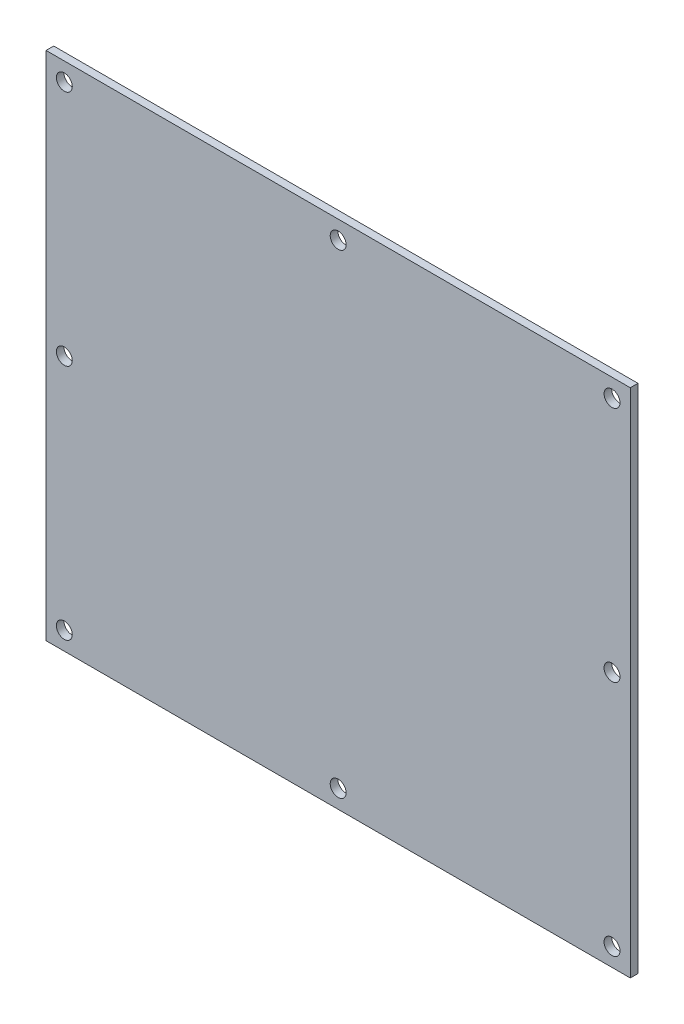
ISO-10303-21;
HEADER;
FILE_DESCRIPTION(('STEP AP214'),'2;1');
FILE_NAME('part.step','',(''),(''),'','','');
FILE_SCHEMA(('AUTOMOTIVE_DESIGN { 1 0 10303 214 1 1 1 1 }'));
ENDSEC;
DATA;
#1=APPLICATION_CONTEXT('core data for automotive mechanical design processes');
#2=APPLICATION_PROTOCOL_DEFINITION('international standard','automotive_design',2000,#1);
#3=PRODUCT_CONTEXT('',#1,'mechanical');
#4=PRODUCT('Part','Part','',(#3));
#5=PRODUCT_RELATED_PRODUCT_CATEGORY('part','',(#4));
#6=PRODUCT_DEFINITION_FORMATION('','',#4);
#7=PRODUCT_DEFINITION_CONTEXT('part definition',#1,'design');
#8=PRODUCT_DEFINITION('design','',#6,#7);
#9=PRODUCT_DEFINITION_SHAPE('','',#8);
#10=(LENGTH_UNIT() NAMED_UNIT(*) SI_UNIT(.MILLI.,.METRE.));
#11=(NAMED_UNIT(*) PLANE_ANGLE_UNIT() SI_UNIT($,.RADIAN.));
#12=(NAMED_UNIT(*) SI_UNIT($,.STERADIAN.) SOLID_ANGLE_UNIT());
#13=UNCERTAINTY_MEASURE_WITH_UNIT(LENGTH_MEASURE(1.E-05),#10,'distance_accuracy_value','');
#14=(GEOMETRIC_REPRESENTATION_CONTEXT(3) GLOBAL_UNCERTAINTY_ASSIGNED_CONTEXT((#13)) GLOBAL_UNIT_ASSIGNED_CONTEXT((#10,
#11,#12)) REPRESENTATION_CONTEXT('',''));
#15=CARTESIAN_POINT('',(0.,0.,0.));
#16=DIRECTION('',(0.,0.,1.));
#17=DIRECTION('',(1.,0.,0.));
#18=AXIS2_PLACEMENT_3D('',#15,#16,#17);
#19=CARTESIAN_POINT('',(0.,0.,2.667));
#20=DIRECTION('',(1.,0.,0.));
#21=DIRECTION('',(0.,0.,-1.));
#22=AXIS2_PLACEMENT_3D('',#19,#20,#21);
#23=PLANE('',#22);
#24=DIRECTION('',(0.,-1.,0.));
#25=VECTOR('',#24,1.);
#26=CARTESIAN_POINT('',(0.,0.,0.));
#27=LINE('',#26,#25);
#28=CARTESIAN_POINT('',(0.,177.8,0.));
#29=VERTEX_POINT('',#28);
#30=CARTESIAN_POINT('',(0.,0.,0.));
#31=VERTEX_POINT('',#30);
#32=EDGE_CURVE('E102',#29,#31,#27,.T.);
#33=ORIENTED_EDGE('',*,*,#32,.T.);
#34=DIRECTION('',(0.,0.,-1.));
#35=VECTOR('',#34,1.);
#36=CARTESIAN_POINT('',(0.,0.,2.667));
#37=LINE('',#36,#35);
#38=CARTESIAN_POINT('',(0.,0.,2.667));
#39=VERTEX_POINT('',#38);
#40=EDGE_CURVE('E11',#39,#31,#37,.T.);
#41=ORIENTED_EDGE('',*,*,#40,.F.);
#42=DIRECTION('',(0.,-1.,0.));
#43=VECTOR('',#42,1.);
#44=CARTESIAN_POINT('',(0.,0.,2.667));
#45=LINE('',#44,#43);
#46=CARTESIAN_POINT('',(0.,177.8,2.667));
#47=VERTEX_POINT('',#46);
#48=EDGE_CURVE('E90',#47,#39,#45,.T.);
#49=ORIENTED_EDGE('',*,*,#48,.F.);
#50=DIRECTION('',(0.,0.,-1.));
#51=VECTOR('',#50,1.);
#52=CARTESIAN_POINT('',(0.,177.8,2.667));
#53=LINE('',#52,#51);
#54=EDGE_CURVE('E98',#47,#29,#53,.T.);
#55=ORIENTED_EDGE('',*,*,#54,.T.);
#56=EDGE_LOOP('',(#33,#41,#49,#55));
#57=FACE_BOUND('',#56,.T.);
#58=ADVANCED_FACE('F39',(#57),#23,.F.);
#59=CARTESIAN_POINT('',(0.,0.,2.667));
#60=DIRECTION('',(0.,1.,0.));
#61=DIRECTION('',(0.,0.,1.));
#62=AXIS2_PLACEMENT_3D('',#59,#60,#61);
#63=PLANE('',#62);
#64=DIRECTION('',(1.,0.,0.));
#65=VECTOR('',#64,1.);
#66=CARTESIAN_POINT('',(0.,0.,0.));
#67=LINE('',#66,#65);
#68=CARTESIAN_POINT('',(203.2,0.,0.));
#69=VERTEX_POINT('',#68);
#70=EDGE_CURVE('E94',#31,#69,#67,.T.);
#71=ORIENTED_EDGE('',*,*,#70,.T.);
#72=DIRECTION('',(0.,0.,-1.));
#73=VECTOR('',#72,1.);
#74=CARTESIAN_POINT('',(203.2,0.,2.667));
#75=LINE('',#74,#73);
#76=CARTESIAN_POINT('',(203.2,0.,2.667));
#77=VERTEX_POINT('',#76);
#78=EDGE_CURVE('E47',#77,#69,#75,.T.);
#79=ORIENTED_EDGE('',*,*,#78,.F.);
#80=DIRECTION('',(1.,0.,0.));
#81=VECTOR('',#80,1.);
#82=CARTESIAN_POINT('',(0.,0.,2.667));
#83=LINE('',#82,#81);
#84=EDGE_CURVE('E85',#39,#77,#83,.T.);
#85=ORIENTED_EDGE('',*,*,#84,.F.);
#86=ORIENTED_EDGE('',*,*,#40,.T.);
#87=EDGE_LOOP('',(#71,#79,#85,#86));
#88=FACE_BOUND('',#87,.T.);
#89=ADVANCED_FACE('F93',(#88),#63,.F.);
#90=CARTESIAN_POINT('',(203.2,0.,2.667));
#91=DIRECTION('',(-1.,0.,0.));
#92=DIRECTION('',(0.,0.,1.));
#93=AXIS2_PLACEMENT_3D('',#90,#91,#92);
#94=PLANE('',#93);
#95=DIRECTION('',(0.,1.,0.));
#96=VECTOR('',#95,1.);
#97=CARTESIAN_POINT('',(203.2,0.,0.));
#98=LINE('',#97,#96);
#99=CARTESIAN_POINT('',(203.2,177.8,0.));
#100=VERTEX_POINT('',#99);
#101=EDGE_CURVE('E72',#69,#100,#98,.T.);
#102=ORIENTED_EDGE('',*,*,#101,.T.);
#103=DIRECTION('',(0.,0.,-1.));
#104=VECTOR('',#103,1.);
#105=CARTESIAN_POINT('',(203.2,177.8,2.667));
#106=LINE('',#105,#104);
#107=CARTESIAN_POINT('',(203.2,177.8,2.667));
#108=VERTEX_POINT('',#107);
#109=EDGE_CURVE('E95',#108,#100,#106,.T.);
#110=ORIENTED_EDGE('',*,*,#109,.F.);
#111=DIRECTION('',(0.,1.,0.));
#112=VECTOR('',#111,1.);
#113=CARTESIAN_POINT('',(203.2,0.,2.667));
#114=LINE('',#113,#112);
#115=EDGE_CURVE('E88',#77,#108,#114,.T.);
#116=ORIENTED_EDGE('',*,*,#115,.F.);
#117=ORIENTED_EDGE('',*,*,#78,.T.);
#118=EDGE_LOOP('',(#102,#110,#116,#117));
#119=FACE_BOUND('',#118,.T.);
#120=ADVANCED_FACE('F96',(#119),#94,.F.);
#121=CARTESIAN_POINT('',(0.,177.8,2.667));
#122=DIRECTION('',(0.,-1.,0.));
#123=DIRECTION('',(0.,0.,-1.));
#124=AXIS2_PLACEMENT_3D('',#121,#122,#123);
#125=PLANE('',#124);
#126=DIRECTION('',(-1.,0.,0.));
#127=VECTOR('',#126,1.);
#128=CARTESIAN_POINT('',(0.,177.8,0.));
#129=LINE('',#128,#127);
#130=EDGE_CURVE('E78',#100,#29,#129,.T.);
#131=ORIENTED_EDGE('',*,*,#130,.T.);
#132=ORIENTED_EDGE('',*,*,#54,.F.);
#133=DIRECTION('',(-1.,0.,0.));
#134=VECTOR('',#133,1.);
#135=CARTESIAN_POINT('',(0.,177.8,2.667));
#136=LINE('',#135,#134);
#137=EDGE_CURVE('E55',#108,#47,#136,.T.);
#138=ORIENTED_EDGE('',*,*,#137,.F.);
#139=ORIENTED_EDGE('',*,*,#109,.T.);
#140=EDGE_LOOP('',(#131,#132,#138,#139));
#141=FACE_BOUND('',#140,.T.);
#142=ADVANCED_FACE('F110',(#141),#125,.F.);
#143=CARTESIAN_POINT('',(0.,0.,2.667));
#144=DIRECTION('',(0.,0.,-1.));
#145=DIRECTION('',(-1.,0.,0.));
#146=AXIS2_PLACEMENT_3D('',#143,#144,#145);
#147=PLANE('',#146);
#148=CARTESIAN_POINT('',(196.85,171.45,2.667));
#149=DIRECTION('',(0.,0.,1.));
#150=DIRECTION('',(1.,0.,0.));
#151=AXIS2_PLACEMENT_3D('',#148,#149,#150);
#152=CIRCLE('',#151,2.76860000000001);
#153=CARTESIAN_POINT('',(199.6186,171.45,2.667));
#154=VERTEX_POINT('',#153);
#155=EDGE_CURVE('E122',#154,#154,#152,.T.);
#156=ORIENTED_EDGE('',*,*,#155,.F.);
#157=EDGE_LOOP('',(#156));
#158=FACE_BOUND('',#157,.T.);
#159=CARTESIAN_POINT('',(101.6,171.45,2.667));
#160=DIRECTION('',(0.,0.,1.));
#161=DIRECTION('',(1.,0.,0.));
#162=AXIS2_PLACEMENT_3D('',#159,#160,#161);
#163=CIRCLE('',#162,2.7686);
#164=CARTESIAN_POINT('',(104.3686,171.45,2.667));
#165=VERTEX_POINT('',#164);
#166=EDGE_CURVE('E128',#165,#165,#163,.T.);
#167=ORIENTED_EDGE('',*,*,#166,.F.);
#168=EDGE_LOOP('',(#167));
#169=FACE_BOUND('',#168,.T.);
#170=CARTESIAN_POINT('',(6.35,171.45,2.667));
#171=DIRECTION('',(0.,0.,1.));
#172=DIRECTION('',(1.,0.,0.));
#173=AXIS2_PLACEMENT_3D('',#170,#171,#172);
#174=CIRCLE('',#173,2.7686);
#175=CARTESIAN_POINT('',(9.1186,171.45,2.667));
#176=VERTEX_POINT('',#175);
#177=EDGE_CURVE('E134',#176,#176,#174,.T.);
#178=ORIENTED_EDGE('',*,*,#177,.F.);
#179=EDGE_LOOP('',(#178));
#180=FACE_BOUND('',#179,.T.);
#181=CARTESIAN_POINT('',(196.85,88.9,2.667));
#182=DIRECTION('',(0.,0.,1.));
#183=DIRECTION('',(1.,0.,0.));
#184=AXIS2_PLACEMENT_3D('',#181,#182,#183);
#185=CIRCLE('',#184,2.76860000000001);
#186=CARTESIAN_POINT('',(199.6186,88.9,2.667));
#187=VERTEX_POINT('',#186);
#188=EDGE_CURVE('E140',#187,#187,#185,.T.);
#189=ORIENTED_EDGE('',*,*,#188,.F.);
#190=EDGE_LOOP('',(#189));
#191=FACE_BOUND('',#190,.T.);
#192=CARTESIAN_POINT('',(6.35,88.9,2.667));
#193=DIRECTION('',(0.,0.,1.));
#194=DIRECTION('',(1.,0.,0.));
#195=AXIS2_PLACEMENT_3D('',#192,#193,#194);
#196=CIRCLE('',#195,2.7686);
#197=CARTESIAN_POINT('',(9.1186,88.9,2.667));
#198=VERTEX_POINT('',#197);
#199=EDGE_CURVE('E146',#198,#198,#196,.T.);
#200=ORIENTED_EDGE('',*,*,#199,.F.);
#201=EDGE_LOOP('',(#200));
#202=FACE_BOUND('',#201,.T.);
#203=CARTESIAN_POINT('',(196.85,6.35,2.667));
#204=DIRECTION('',(0.,0.,1.));
#205=DIRECTION('',(1.,0.,0.));
#206=AXIS2_PLACEMENT_3D('',#203,#204,#205);
#207=CIRCLE('',#206,2.76860000000001);
#208=CARTESIAN_POINT('',(199.6186,6.35,2.667));
#209=VERTEX_POINT('',#208);
#210=EDGE_CURVE('E152',#209,#209,#207,.T.);
#211=ORIENTED_EDGE('',*,*,#210,.F.);
#212=EDGE_LOOP('',(#211));
#213=FACE_BOUND('',#212,.T.);
#214=CARTESIAN_POINT('',(101.6,6.35,2.667));
#215=DIRECTION('',(0.,0.,1.));
#216=DIRECTION('',(1.,0.,0.));
#217=AXIS2_PLACEMENT_3D('',#214,#215,#216);
#218=CIRCLE('',#217,2.76859999999999);
#219=CARTESIAN_POINT('',(104.3686,6.35,2.667));
#220=VERTEX_POINT('',#219);
#221=EDGE_CURVE('E158',#220,#220,#218,.T.);
#222=ORIENTED_EDGE('',*,*,#221,.F.);
#223=EDGE_LOOP('',(#222));
#224=FACE_BOUND('',#223,.T.);
#225=CARTESIAN_POINT('',(6.35,6.35,2.667));
#226=DIRECTION('',(0.,0.,1.));
#227=DIRECTION('',(1.,0.,0.));
#228=AXIS2_PLACEMENT_3D('',#225,#226,#227);
#229=CIRCLE('',#228,2.7686);
#230=CARTESIAN_POINT('',(9.1186,6.35,2.667));
#231=VERTEX_POINT('',#230);
#232=EDGE_CURVE('E105',#231,#231,#229,.T.);
#233=ORIENTED_EDGE('',*,*,#232,.F.);
#234=EDGE_LOOP('',(#233));
#235=FACE_BOUND('',#234,.T.);
#236=ORIENTED_EDGE('',*,*,#48,.T.);
#237=ORIENTED_EDGE('',*,*,#84,.T.);
#238=ORIENTED_EDGE('',*,*,#115,.T.);
#239=ORIENTED_EDGE('',*,*,#137,.T.);
#240=EDGE_LOOP('',(#236,#237,#238,#239));
#241=FACE_BOUND('',#240,.T.);
#242=ADVANCED_FACE('F86',(#158,#169,#180,#191,#202,#213,#224,#235,#241),#147,.F.);
#243=CARTESIAN_POINT('',(0.,0.,0.));
#244=DIRECTION('',(0.,0.,-1.));
#245=DIRECTION('',(-1.,0.,0.));
#246=AXIS2_PLACEMENT_3D('',#243,#244,#245);
#247=PLANE('',#246);
#248=CARTESIAN_POINT('',(196.85,171.45,0.));
#249=DIRECTION('',(0.,0.,1.));
#250=DIRECTION('',(1.,0.,0.));
#251=AXIS2_PLACEMENT_3D('',#248,#249,#250);
#252=CIRCLE('',#251,2.76860000000001);
#253=CARTESIAN_POINT('',(199.6186,171.45,0.));
#254=VERTEX_POINT('',#253);
#255=EDGE_CURVE('E125',#254,#254,#252,.T.);
#256=ORIENTED_EDGE('',*,*,#255,.T.);
#257=EDGE_LOOP('',(#256));
#258=FACE_BOUND('',#257,.T.);
#259=CARTESIAN_POINT('',(101.6,171.45,0.));
#260=DIRECTION('',(0.,0.,1.));
#261=DIRECTION('',(1.,0.,0.));
#262=AXIS2_PLACEMENT_3D('',#259,#260,#261);
#263=CIRCLE('',#262,2.7686);
#264=CARTESIAN_POINT('',(104.3686,171.45,0.));
#265=VERTEX_POINT('',#264);
#266=EDGE_CURVE('E131',#265,#265,#263,.T.);
#267=ORIENTED_EDGE('',*,*,#266,.T.);
#268=EDGE_LOOP('',(#267));
#269=FACE_BOUND('',#268,.T.);
#270=CARTESIAN_POINT('',(6.35,171.45,0.));
#271=DIRECTION('',(0.,0.,1.));
#272=DIRECTION('',(1.,0.,0.));
#273=AXIS2_PLACEMENT_3D('',#270,#271,#272);
#274=CIRCLE('',#273,2.7686);
#275=CARTESIAN_POINT('',(9.1186,171.45,0.));
#276=VERTEX_POINT('',#275);
#277=EDGE_CURVE('E137',#276,#276,#274,.T.);
#278=ORIENTED_EDGE('',*,*,#277,.T.);
#279=EDGE_LOOP('',(#278));
#280=FACE_BOUND('',#279,.T.);
#281=CARTESIAN_POINT('',(196.85,88.9,0.));
#282=DIRECTION('',(0.,0.,1.));
#283=DIRECTION('',(1.,0.,0.));
#284=AXIS2_PLACEMENT_3D('',#281,#282,#283);
#285=CIRCLE('',#284,2.76860000000001);
#286=CARTESIAN_POINT('',(199.6186,88.9,0.));
#287=VERTEX_POINT('',#286);
#288=EDGE_CURVE('E143',#287,#287,#285,.T.);
#289=ORIENTED_EDGE('',*,*,#288,.T.);
#290=EDGE_LOOP('',(#289));
#291=FACE_BOUND('',#290,.T.);
#292=CARTESIAN_POINT('',(6.35,88.9,0.));
#293=DIRECTION('',(0.,0.,1.));
#294=DIRECTION('',(1.,0.,0.));
#295=AXIS2_PLACEMENT_3D('',#292,#293,#294);
#296=CIRCLE('',#295,2.7686);
#297=CARTESIAN_POINT('',(9.1186,88.9,0.));
#298=VERTEX_POINT('',#297);
#299=EDGE_CURVE('E149',#298,#298,#296,.T.);
#300=ORIENTED_EDGE('',*,*,#299,.T.);
#301=EDGE_LOOP('',(#300));
#302=FACE_BOUND('',#301,.T.);
#303=CARTESIAN_POINT('',(196.85,6.35,0.));
#304=DIRECTION('',(0.,0.,1.));
#305=DIRECTION('',(1.,0.,0.));
#306=AXIS2_PLACEMENT_3D('',#303,#304,#305);
#307=CIRCLE('',#306,2.76860000000001);
#308=CARTESIAN_POINT('',(199.6186,6.35,0.));
#309=VERTEX_POINT('',#308);
#310=EDGE_CURVE('E155',#309,#309,#307,.T.);
#311=ORIENTED_EDGE('',*,*,#310,.T.);
#312=EDGE_LOOP('',(#311));
#313=FACE_BOUND('',#312,.T.);
#314=CARTESIAN_POINT('',(101.6,6.35,0.));
#315=DIRECTION('',(0.,0.,1.));
#316=DIRECTION('',(1.,0.,0.));
#317=AXIS2_PLACEMENT_3D('',#314,#315,#316);
#318=CIRCLE('',#317,2.76859999999999);
#319=CARTESIAN_POINT('',(104.3686,6.35,0.));
#320=VERTEX_POINT('',#319);
#321=EDGE_CURVE('E119',#320,#320,#318,.T.);
#322=ORIENTED_EDGE('',*,*,#321,.T.);
#323=EDGE_LOOP('',(#322));
#324=FACE_BOUND('',#323,.T.);
#325=CARTESIAN_POINT('',(6.35,6.35,0.));
#326=DIRECTION('',(0.,0.,1.));
#327=DIRECTION('',(1.,0.,0.));
#328=AXIS2_PLACEMENT_3D('',#325,#326,#327);
#329=CIRCLE('',#328,2.7686);
#330=CARTESIAN_POINT('',(9.1186,6.35,0.));
#331=VERTEX_POINT('',#330);
#332=EDGE_CURVE('E116',#331,#331,#329,.T.);
#333=ORIENTED_EDGE('',*,*,#332,.T.);
#334=EDGE_LOOP('',(#333));
#335=FACE_BOUND('',#334,.T.);
#336=ORIENTED_EDGE('',*,*,#32,.F.);
#337=ORIENTED_EDGE('',*,*,#130,.F.);
#338=ORIENTED_EDGE('',*,*,#101,.F.);
#339=ORIENTED_EDGE('',*,*,#70,.F.);
#340=EDGE_LOOP('',(#336,#337,#338,#339));
#341=FACE_BOUND('',#340,.T.);
#342=ADVANCED_FACE('F113',(#258,#269,#280,#291,#302,#313,#324,#335,#341),#247,.T.);
#343=CARTESIAN_POINT('',(6.35,6.35,2.667));
#344=DIRECTION('',(0.,0.,-1.));
#345=DIRECTION('',(-1.,0.,0.));
#346=AXIS2_PLACEMENT_3D('',#343,#344,#345);
#347=CYLINDRICAL_SURFACE('',#346,2.7686);
#348=ORIENTED_EDGE('',*,*,#232,.T.);
#349=EDGE_LOOP('',(#348));
#350=FACE_BOUND('',#349,.T.);
#351=ORIENTED_EDGE('',*,*,#332,.F.);
#352=EDGE_LOOP('',(#351));
#353=FACE_BOUND('',#352,.T.);
#354=ADVANCED_FACE('F169',(#350,#353),#347,.F.);
#355=CARTESIAN_POINT('',(101.6,6.35,2.667));
#356=DIRECTION('',(0.,0.,-1.));
#357=DIRECTION('',(-1.,0.,0.));
#358=AXIS2_PLACEMENT_3D('',#355,#356,#357);
#359=CYLINDRICAL_SURFACE('',#358,2.76859999999999);
#360=ORIENTED_EDGE('',*,*,#221,.T.);
#361=EDGE_LOOP('',(#360));
#362=FACE_BOUND('',#361,.T.);
#363=ORIENTED_EDGE('',*,*,#321,.F.);
#364=EDGE_LOOP('',(#363));
#365=FACE_BOUND('',#364,.T.);
#366=ADVANCED_FACE('F166',(#362,#365),#359,.F.);
#367=CARTESIAN_POINT('',(196.85,6.35,2.667));
#368=DIRECTION('',(0.,0.,-1.));
#369=DIRECTION('',(-1.,0.,0.));
#370=AXIS2_PLACEMENT_3D('',#367,#368,#369);
#371=CYLINDRICAL_SURFACE('',#370,2.76860000000001);
#372=ORIENTED_EDGE('',*,*,#210,.T.);
#373=EDGE_LOOP('',(#372));
#374=FACE_BOUND('',#373,.T.);
#375=ORIENTED_EDGE('',*,*,#310,.F.);
#376=EDGE_LOOP('',(#375));
#377=FACE_BOUND('',#376,.T.);
#378=ADVANCED_FACE('F168',(#374,#377),#371,.F.);
#379=CARTESIAN_POINT('',(6.35,88.9,2.667));
#380=DIRECTION('',(0.,0.,-1.));
#381=DIRECTION('',(-1.,0.,0.));
#382=AXIS2_PLACEMENT_3D('',#379,#380,#381);
#383=CYLINDRICAL_SURFACE('',#382,2.7686);
#384=ORIENTED_EDGE('',*,*,#199,.T.);
#385=EDGE_LOOP('',(#384));
#386=FACE_BOUND('',#385,.T.);
#387=ORIENTED_EDGE('',*,*,#299,.F.);
#388=EDGE_LOOP('',(#387));
#389=FACE_BOUND('',#388,.T.);
#390=ADVANCED_FACE('F176',(#386,#389),#383,.F.);
#391=CARTESIAN_POINT('',(196.85,88.9,2.667));
#392=DIRECTION('',(0.,0.,-1.));
#393=DIRECTION('',(-1.,0.,0.));
#394=AXIS2_PLACEMENT_3D('',#391,#392,#393);
#395=CYLINDRICAL_SURFACE('',#394,2.76860000000001);
#396=ORIENTED_EDGE('',*,*,#188,.T.);
#397=EDGE_LOOP('',(#396));
#398=FACE_BOUND('',#397,.T.);
#399=ORIENTED_EDGE('',*,*,#288,.F.);
#400=EDGE_LOOP('',(#399));
#401=FACE_BOUND('',#400,.T.);
#402=ADVANCED_FACE('F209',(#398,#401),#395,.F.);
#403=CARTESIAN_POINT('',(6.35,171.45,2.667));
#404=DIRECTION('',(0.,0.,-1.));
#405=DIRECTION('',(-1.,0.,0.));
#406=AXIS2_PLACEMENT_3D('',#403,#404,#405);
#407=CYLINDRICAL_SURFACE('',#406,2.7686);
#408=ORIENTED_EDGE('',*,*,#177,.T.);
#409=EDGE_LOOP('',(#408));
#410=FACE_BOUND('',#409,.T.);
#411=ORIENTED_EDGE('',*,*,#277,.F.);
#412=EDGE_LOOP('',(#411));
#413=FACE_BOUND('',#412,.T.);
#414=ADVANCED_FACE('F205',(#410,#413),#407,.F.);
#415=CARTESIAN_POINT('',(101.6,171.45,2.667));
#416=DIRECTION('',(0.,0.,-1.));
#417=DIRECTION('',(-1.,0.,0.));
#418=AXIS2_PLACEMENT_3D('',#415,#416,#417);
#419=CYLINDRICAL_SURFACE('',#418,2.7686);
#420=ORIENTED_EDGE('',*,*,#166,.T.);
#421=EDGE_LOOP('',(#420));
#422=FACE_BOUND('',#421,.T.);
#423=ORIENTED_EDGE('',*,*,#266,.F.);
#424=EDGE_LOOP('',(#423));
#425=FACE_BOUND('',#424,.T.);
#426=ADVANCED_FACE('F201',(#422,#425),#419,.F.);
#427=CARTESIAN_POINT('',(196.85,171.45,2.667));
#428=DIRECTION('',(0.,0.,-1.));
#429=DIRECTION('',(-1.,0.,0.));
#430=AXIS2_PLACEMENT_3D('',#427,#428,#429);
#431=CYLINDRICAL_SURFACE('',#430,2.76860000000001);
#432=ORIENTED_EDGE('',*,*,#155,.T.);
#433=EDGE_LOOP('',(#432));
#434=FACE_BOUND('',#433,.T.);
#435=ORIENTED_EDGE('',*,*,#255,.F.);
#436=EDGE_LOOP('',(#435));
#437=FACE_BOUND('',#436,.T.);
#438=ADVANCED_FACE('F198',(#434,#437),#431,.F.);
#439=CLOSED_SHELL('',(#58,#89,#120,#142,#242,#342,#354,#366,#378,#390,#402,#414,#426,#438));
#440=MANIFOLD_SOLID_BREP('B2',#439);
#441=ADVANCED_BREP_SHAPE_REPRESENTATION('',(#18,#440),#14);
#442=SHAPE_DEFINITION_REPRESENTATION(#9,#441);
ENDSEC;
END-ISO-10303-21;
